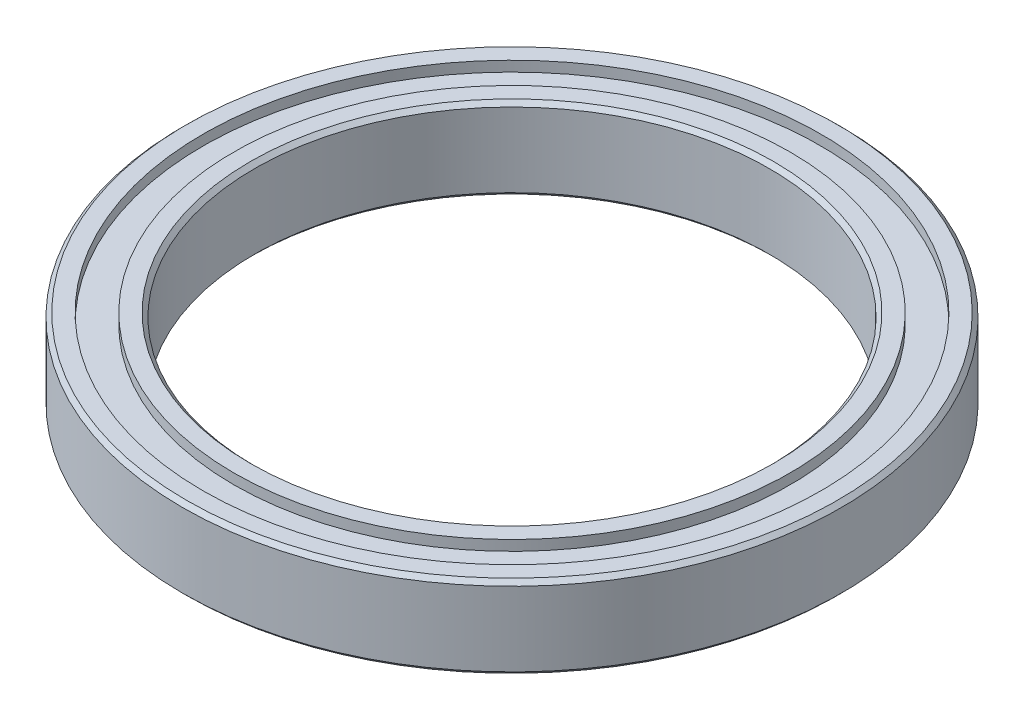
ISO-10303-21;
HEADER;
FILE_DESCRIPTION(('STEP AP214'),'2;1');
FILE_NAME('part.step','',(''),(''),'','','');
FILE_SCHEMA(('AUTOMOTIVE_DESIGN { 1 0 10303 214 1 1 1 1 }'));
ENDSEC;
DATA;
#1=APPLICATION_CONTEXT('core data for automotive mechanical design processes');
#2=APPLICATION_PROTOCOL_DEFINITION('international standard','automotive_design',2000,#1);
#3=PRODUCT_CONTEXT('',#1,'mechanical');
#4=PRODUCT('Part','Part','',(#3));
#5=PRODUCT_RELATED_PRODUCT_CATEGORY('part','',(#4));
#6=PRODUCT_DEFINITION_FORMATION('','',#4);
#7=PRODUCT_DEFINITION_CONTEXT('part definition',#1,'design');
#8=PRODUCT_DEFINITION('design','',#6,#7);
#9=PRODUCT_DEFINITION_SHAPE('','',#8);
#10=(LENGTH_UNIT() NAMED_UNIT(*) SI_UNIT(.MILLI.,.METRE.));
#11=(NAMED_UNIT(*) PLANE_ANGLE_UNIT() SI_UNIT($,.RADIAN.));
#12=(NAMED_UNIT(*) SI_UNIT($,.STERADIAN.) SOLID_ANGLE_UNIT());
#13=UNCERTAINTY_MEASURE_WITH_UNIT(LENGTH_MEASURE(1.E-05),#10,'distance_accuracy_value','');
#14=(GEOMETRIC_REPRESENTATION_CONTEXT(3) GLOBAL_UNCERTAINTY_ASSIGNED_CONTEXT((#13)) GLOBAL_UNIT_ASSIGNED_CONTEXT((#10,
#11,#12)) REPRESENTATION_CONTEXT('',''));
#15=CARTESIAN_POINT('',(0.,0.,0.));
#16=DIRECTION('',(0.,0.,1.));
#17=DIRECTION('',(1.,0.,0.));
#18=AXIS2_PLACEMENT_3D('',#15,#16,#17);
#19=CARTESIAN_POINT('',(0.,0.,0.));
#20=DIRECTION('',(0.,1.,0.));
#21=DIRECTION('',(0.,0.,1.));
#22=AXIS2_PLACEMENT_3D('',#19,#20,#21);
#23=PLANE('',#22);
#24=CARTESIAN_POINT('',(0.,0.,0.));
#25=DIRECTION('',(0.,1.,0.));
#26=DIRECTION('',(0.,0.,1.));
#27=AXIS2_PLACEMENT_3D('',#24,#25,#26);
#28=CIRCLE('',#27,12.7);
#29=CARTESIAN_POINT('',(0.,0.,12.7));
#30=VERTEX_POINT('',#29);
#31=EDGE_CURVE('E72',#30,#30,#28,.T.);
#32=ORIENTED_EDGE('',*,*,#31,.T.);
#33=EDGE_LOOP('',(#32));
#34=FACE_BOUND('',#33,.T.);
#35=CARTESIAN_POINT('',(0.,0.,0.));
#36=DIRECTION('',(0.,-1.,0.));
#37=DIRECTION('',(0.,0.,-1.));
#38=AXIS2_PLACEMENT_3D('',#35,#36,#37);
#39=CIRCLE('',#38,13.5);
#40=CARTESIAN_POINT('',(0.,0.,-13.5));
#41=VERTEX_POINT('',#40);
#42=EDGE_CURVE('E105',#41,#41,#39,.T.);
#43=ORIENTED_EDGE('',*,*,#42,.T.);
#44=EDGE_LOOP('',(#43));
#45=FACE_BOUND('',#44,.T.);
#46=ADVANCED_FACE('F39',(#34,#45),#23,.F.);
#47=CARTESIAN_POINT('',(0.,4.,0.));
#48=DIRECTION('',(0.,1.,0.));
#49=DIRECTION('',(0.,0.,1.));
#50=AXIS2_PLACEMENT_3D('',#47,#48,#49);
#51=PLANE('',#50);
#52=CARTESIAN_POINT('',(0.,4.,0.));
#53=DIRECTION('',(0.,1.,0.));
#54=DIRECTION('',(0.,0.,1.));
#55=AXIS2_PLACEMENT_3D('',#52,#53,#54);
#56=CIRCLE('',#55,12.7);
#57=CARTESIAN_POINT('',(0.,4.,12.7));
#58=VERTEX_POINT('',#57);
#59=EDGE_CURVE('E58',#58,#58,#56,.F.);
#60=ORIENTED_EDGE('',*,*,#59,.T.);
#61=EDGE_LOOP('',(#60));
#62=FACE_BOUND('',#61,.T.);
#63=CARTESIAN_POINT('',(0.,4.,0.));
#64=DIRECTION('',(0.,1.,0.));
#65=DIRECTION('',(0.,0.,1.));
#66=AXIS2_PLACEMENT_3D('',#63,#64,#65);
#67=CIRCLE('',#66,13.5);
#68=CARTESIAN_POINT('',(0.,4.,13.5));
#69=VERTEX_POINT('',#68);
#70=EDGE_CURVE('E89',#69,#69,#67,.T.);
#71=ORIENTED_EDGE('',*,*,#70,.T.);
#72=EDGE_LOOP('',(#71));
#73=FACE_BOUND('',#72,.T.);
#74=ADVANCED_FACE('F152',(#62,#73),#51,.T.);
#75=CARTESIAN_POINT('',(0.,4.,0.));
#76=DIRECTION('',(0.,1.,0.));
#77=DIRECTION('',(0.,0.,1.));
#78=AXIS2_PLACEMENT_3D('',#75,#76,#77);
#79=CIRCLE('',#78,15.);
#80=CARTESIAN_POINT('',(0.,4.,15.));
#81=VERTEX_POINT('',#80);
#82=EDGE_CURVE('E81',#81,#81,#79,.T.);
#83=ORIENTED_EDGE('',*,*,#82,.F.);
#84=EDGE_LOOP('',(#83));
#85=FACE_BOUND('',#84,.T.);
#86=CARTESIAN_POINT('',(0.,4.,0.));
#87=DIRECTION('',(0.,1.,0.));
#88=DIRECTION('',(0.,0.,1.));
#89=AXIS2_PLACEMENT_3D('',#86,#87,#88);
#90=CIRCLE('',#89,15.8);
#91=CARTESIAN_POINT('',(0.,4.,15.8));
#92=VERTEX_POINT('',#91);
#93=EDGE_CURVE('E53',#92,#92,#90,.T.);
#94=ORIENTED_EDGE('',*,*,#93,.T.);
#95=EDGE_LOOP('',(#94));
#96=FACE_BOUND('',#95,.T.);
#97=ADVANCED_FACE('F133',(#85,#96),#51,.T.);
#98=CARTESIAN_POINT('',(0.,0.,0.));
#99=DIRECTION('',(0.,-1.,0.));
#100=DIRECTION('',(0.,0.,-1.));
#101=AXIS2_PLACEMENT_3D('',#98,#99,#100);
#102=CIRCLE('',#101,15.);
#103=CARTESIAN_POINT('',(0.,0.,-15.));
#104=VERTEX_POINT('',#103);
#105=EDGE_CURVE('E97',#104,#104,#102,.T.);
#106=ORIENTED_EDGE('',*,*,#105,.F.);
#107=EDGE_LOOP('',(#106));
#108=FACE_BOUND('',#107,.T.);
#109=CARTESIAN_POINT('',(0.,0.,0.));
#110=DIRECTION('',(0.,1.,0.));
#111=DIRECTION('',(0.,0.,1.));
#112=AXIS2_PLACEMENT_3D('',#109,#110,#111);
#113=CIRCLE('',#112,15.8);
#114=CARTESIAN_POINT('',(0.,0.,15.8));
#115=VERTEX_POINT('',#114);
#116=EDGE_CURVE('E76',#115,#115,#113,.F.);
#117=ORIENTED_EDGE('',*,*,#116,.T.);
#118=EDGE_LOOP('',(#117));
#119=FACE_BOUND('',#118,.T.);
#120=ADVANCED_FACE('F129',(#108,#119),#23,.F.);
#121=CARTESIAN_POINT('',(0.,4.,0.));
#122=DIRECTION('',(0.,-1.,0.));
#123=DIRECTION('',(0.,0.,-1.));
#124=AXIS2_PLACEMENT_3D('',#121,#122,#123);
#125=CYLINDRICAL_SURFACE('',#124,16.);
#126=CARTESIAN_POINT('',(0.,3.8,0.));
#127=DIRECTION('',(0.,1.,0.));
#128=DIRECTION('',(0.,0.,1.));
#129=AXIS2_PLACEMENT_3D('',#126,#127,#128);
#130=CIRCLE('',#129,16.);
#131=CARTESIAN_POINT('',(0.,3.8,16.));
#132=VERTEX_POINT('',#131);
#133=EDGE_CURVE('E10',#132,#132,#130,.F.);
#134=ORIENTED_EDGE('',*,*,#133,.T.);
#135=EDGE_LOOP('',(#134));
#136=FACE_BOUND('',#135,.T.);
#137=CARTESIAN_POINT('',(0.,0.199999999999999,0.));
#138=DIRECTION('',(0.,1.,0.));
#139=DIRECTION('',(0.,0.,1.));
#140=AXIS2_PLACEMENT_3D('',#137,#138,#139);
#141=CIRCLE('',#140,16.);
#142=CARTESIAN_POINT('',(0.,0.199999999999999,16.));
#143=VERTEX_POINT('',#142);
#144=EDGE_CURVE('E48',#143,#143,#141,.T.);
#145=ORIENTED_EDGE('',*,*,#144,.T.);
#146=EDGE_LOOP('',(#145));
#147=FACE_BOUND('',#146,.T.);
#148=ADVANCED_FACE('F132',(#136,#147),#125,.T.);
#149=CARTESIAN_POINT('',(0.,4.,0.));
#150=DIRECTION('',(0.,-1.,0.));
#151=DIRECTION('',(0.,0.,-1.));
#152=AXIS2_PLACEMENT_3D('',#149,#150,#151);
#153=CYLINDRICAL_SURFACE('',#152,12.5);
#154=CARTESIAN_POINT('',(0.,0.19999999999999,0.));
#155=DIRECTION('',(0.,1.,0.));
#156=DIRECTION('',(0.,0.,1.));
#157=AXIS2_PLACEMENT_3D('',#154,#155,#156);
#158=CIRCLE('',#157,12.5);
#159=CARTESIAN_POINT('',(0.,0.19999999999999,12.5));
#160=VERTEX_POINT('',#159);
#161=EDGE_CURVE('E64',#160,#160,#158,.F.);
#162=ORIENTED_EDGE('',*,*,#161,.T.);
#163=EDGE_LOOP('',(#162));
#164=FACE_BOUND('',#163,.T.);
#165=CARTESIAN_POINT('',(0.,3.79999999999998,0.));
#166=DIRECTION('',(0.,1.,0.));
#167=DIRECTION('',(0.,0.,1.));
#168=AXIS2_PLACEMENT_3D('',#165,#166,#167);
#169=CIRCLE('',#168,12.5);
#170=CARTESIAN_POINT('',(0.,3.79999999999998,12.5));
#171=VERTEX_POINT('',#170);
#172=EDGE_CURVE('E68',#171,#171,#169,.T.);
#173=ORIENTED_EDGE('',*,*,#172,.T.);
#174=EDGE_LOOP('',(#173));
#175=FACE_BOUND('',#174,.T.);
#176=ADVANCED_FACE('F164',(#164,#175),#153,.F.);
#177=CARTESIAN_POINT('',(0.,0.,0.));
#178=DIRECTION('',(0.,-1.,0.));
#179=DIRECTION('',(0.,0.,-1.));
#180=AXIS2_PLACEMENT_3D('',#177,#178,#179);
#181=CONICAL_SURFACE('',#180,12.7,0.785398163397453);
#182=ORIENTED_EDGE('',*,*,#161,.F.);
#183=EDGE_LOOP('',(#182));
#184=FACE_BOUND('',#183,.T.);
#185=ORIENTED_EDGE('',*,*,#31,.F.);
#186=EDGE_LOOP('',(#185));
#187=FACE_BOUND('',#186,.T.);
#188=ADVANCED_FACE('F147',(#184,#187),#181,.F.);
#189=CARTESIAN_POINT('',(0.,4.,0.));
#190=DIRECTION('',(0.,-1.,0.));
#191=DIRECTION('',(0.,0.,-1.));
#192=AXIS2_PLACEMENT_3D('',#189,#190,#191);
#193=CONICAL_SURFACE('',#192,15.8,0.785398163397448);
#194=ORIENTED_EDGE('',*,*,#133,.F.);
#195=EDGE_LOOP('',(#194));
#196=FACE_BOUND('',#195,.T.);
#197=ORIENTED_EDGE('',*,*,#93,.F.);
#198=EDGE_LOOP('',(#197));
#199=FACE_BOUND('',#198,.T.);
#200=ADVANCED_FACE('F140',(#196,#199),#193,.T.);
#201=CARTESIAN_POINT('',(0.,0.199999999999999,0.));
#202=DIRECTION('',(0.,1.,0.));
#203=DIRECTION('',(0.,0.,1.));
#204=AXIS2_PLACEMENT_3D('',#201,#202,#203);
#205=CONICAL_SURFACE('',#204,16.,0.785398163397448);
#206=ORIENTED_EDGE('',*,*,#116,.F.);
#207=EDGE_LOOP('',(#206));
#208=FACE_BOUND('',#207,.T.);
#209=ORIENTED_EDGE('',*,*,#144,.F.);
#210=EDGE_LOOP('',(#209));
#211=FACE_BOUND('',#210,.T.);
#212=ADVANCED_FACE('F137',(#208,#211),#205,.T.);
#213=CARTESIAN_POINT('',(0.,3.79999999999998,0.));
#214=DIRECTION('',(0.,1.,0.));
#215=DIRECTION('',(0.,0.,1.));
#216=AXIS2_PLACEMENT_3D('',#213,#214,#215);
#217=CONICAL_SURFACE('',#216,12.5,0.78539816339744);
#218=CARTESIAN_POINT('',(0.,4.,12.7));
#219=CARTESIAN_POINT('',(0.,3.99791666666667,12.6979166666667));
#220=CARTESIAN_POINT('',(0.,3.99583333333333,12.6958333333334));
#221=CARTESIAN_POINT('',(0.,3.99166666666666,12.6916666666667));
#222=CARTESIAN_POINT('',(0.,3.98958333333333,12.6895833333333));
#223=CARTESIAN_POINT('',(0.,3.98541666666666,12.6854166666667));
#224=CARTESIAN_POINT('',(0.,3.98333333333333,12.6833333333333));
#225=CARTESIAN_POINT('',(0.,3.97916666666666,12.6791666666667));
#226=CARTESIAN_POINT('',(0.,3.97708333333333,12.6770833333333));
#227=CARTESIAN_POINT('',(0.,3.97291666666666,12.6729166666667));
#228=CARTESIAN_POINT('',(0.,3.97083333333333,12.6708333333333));
#229=CARTESIAN_POINT('',(0.,3.96666666666666,12.6666666666667));
#230=CARTESIAN_POINT('',(0.,3.96458333333333,12.6645833333333));
#231=CARTESIAN_POINT('',(0.,3.96041666666666,12.6604166666667));
#232=CARTESIAN_POINT('',(0.,3.95833333333333,12.6583333333333));
#233=CARTESIAN_POINT('',(0.,3.95416666666666,12.6541666666667));
#234=CARTESIAN_POINT('',(0.,3.95208333333333,12.6520833333333));
#235=CARTESIAN_POINT('',(0.,3.94791666666666,12.6479166666667));
#236=CARTESIAN_POINT('',(0.,3.94583333333333,12.6458333333333));
#237=CARTESIAN_POINT('',(0.,3.94166666666666,12.6416666666667));
#238=CARTESIAN_POINT('',(0.,3.93958333333333,12.6395833333333));
#239=CARTESIAN_POINT('',(0.,3.93541666666666,12.6354166666667));
#240=CARTESIAN_POINT('',(0.,3.93333333333333,12.6333333333333));
#241=CARTESIAN_POINT('',(0.,3.92916666666666,12.6291666666667));
#242=CARTESIAN_POINT('',(0.,3.92708333333333,12.6270833333333));
#243=CARTESIAN_POINT('',(0.,3.92291666666666,12.6229166666667));
#244=CARTESIAN_POINT('',(0.,3.92083333333332,12.6208333333333));
#245=CARTESIAN_POINT('',(0.,3.91666666666666,12.6166666666667));
#246=CARTESIAN_POINT('',(0.,3.91458333333332,12.6145833333333));
#247=CARTESIAN_POINT('',(0.,3.91041666666666,12.6104166666667));
#248=CARTESIAN_POINT('',(0.,3.90833333333332,12.6083333333333));
#249=CARTESIAN_POINT('',(0.,3.90416666666666,12.6041666666667));
#250=CARTESIAN_POINT('',(0.,3.90208333333332,12.6020833333333));
#251=CARTESIAN_POINT('',(0.,3.89791666666666,12.5979166666667));
#252=CARTESIAN_POINT('',(0.,3.89583333333332,12.5958333333333));
#253=CARTESIAN_POINT('',(0.,3.89166666666665,12.5916666666667));
#254=CARTESIAN_POINT('',(0.,3.88958333333332,12.5895833333333));
#255=CARTESIAN_POINT('',(0.,3.88541666666665,12.5854166666667));
#256=CARTESIAN_POINT('',(0.,3.88333333333332,12.5833333333333));
#257=CARTESIAN_POINT('',(0.,3.87916666666665,12.5791666666667));
#258=CARTESIAN_POINT('',(0.,3.87708333333332,12.5770833333333));
#259=CARTESIAN_POINT('',(0.,3.87291666666665,12.5729166666667));
#260=CARTESIAN_POINT('',(0.,3.87083333333332,12.5708333333333));
#261=CARTESIAN_POINT('',(0.,3.86666666666665,12.5666666666667));
#262=CARTESIAN_POINT('',(0.,3.86458333333332,12.5645833333333));
#263=CARTESIAN_POINT('',(0.,3.86041666666665,12.5604166666667));
#264=CARTESIAN_POINT('',(0.,3.85833333333332,12.5583333333333));
#265=CARTESIAN_POINT('',(0.,3.85416666666665,12.5541666666667));
#266=CARTESIAN_POINT('',(0.,3.85208333333332,12.5520833333333));
#267=CARTESIAN_POINT('',(0.,3.84791666666665,12.5479166666667));
#268=CARTESIAN_POINT('',(0.,3.84583333333332,12.5458333333333));
#269=CARTESIAN_POINT('',(0.,3.84166666666665,12.5416666666667));
#270=CARTESIAN_POINT('',(0.,3.83958333333332,12.5395833333333));
#271=CARTESIAN_POINT('',(0.,3.83541666666665,12.5354166666667));
#272=CARTESIAN_POINT('',(0.,3.83333333333332,12.5333333333333));
#273=CARTESIAN_POINT('',(0.,3.82916666666665,12.5291666666667));
#274=CARTESIAN_POINT('',(0.,3.82708333333331,12.5270833333333));
#275=CARTESIAN_POINT('',(0.,3.82291666666665,12.5229166666667));
#276=CARTESIAN_POINT('',(0.,3.82083333333331,12.5208333333333));
#277=CARTESIAN_POINT('',(0.,3.81666666666665,12.5166666666667));
#278=CARTESIAN_POINT('',(0.,3.81458333333331,12.5145833333333));
#279=CARTESIAN_POINT('',(0.,3.81041666666665,12.5104166666667));
#280=CARTESIAN_POINT('',(0.,3.80833333333331,12.5083333333333));
#281=CARTESIAN_POINT('',(0.,3.80416666666665,12.5041666666667));
#282=CARTESIAN_POINT('',(0.,3.80208333333331,12.5020833333333));
#283=CARTESIAN_POINT('',(0.,3.79999999999998,12.5));
#284=B_SPLINE_CURVE_WITH_KNOTS('',3,(#218,#219,#220,#221,#222,#223,#224,#225,#226,#227,#228,
#229,#230,#231,#232,#233,#234,#235,#236,#237,#238,#239,#240,#241,#242,#243,#244,#245,#246,#247,
#248,#249,#250,#251,#252,#253,#254,#255,#256,#257,#258,#259,#260,#261,#262,#263,#264,#265,#266,
#267,#268,#269,#270,#271,#272,#273,#274,#275,#276,#277,#278,#279,#280,#281,#282,#283),
.UNSPECIFIED.,.F.,.F.,(4,2,2,2,2,2,2,2,2,2,2,2,2,2,2,2,2,2,2,2,2,2,2,2,2,2,2,2,2,2,2,2,4),(0.,
0.00883883476483271,0.017677669529666,0.0265165042944975,0.0353553390593308,0.0441941738241635,
0.0530330085889969,0.0618718433538284,0.0707106781186617,0.079549512883495,0.0883883476483265,
0.0972271824131598,0.106066017177993,0.114904851942826,0.123743686707657,0.132582521472491,
0.141421356237324,0.150260191002155,0.159099025766988,0.167937860531821,0.176776695296655,
0.185615530061486,0.194454364826319,0.203293199591153,0.212132034355984,0.220970869120817,
0.229809703885651,0.238648538650484,0.247487373415315,0.256326208180148,0.265165042944981,
0.274003877709813,0.282842712474646),.UNSPECIFIED.);
#285=EDGE_CURVE('BSEAM42',#58,#171,#284,.T.);
#286=ORIENTED_EDGE('',*,*,#59,.F.);
#287=ORIENTED_EDGE('',*,*,#172,.F.);
#288=ORIENTED_EDGE('',*,*,#285,.T.);
#289=ORIENTED_EDGE('',*,*,#285,.F.);
#290=EDGE_LOOP('',(#286,#288,#287,#289));
#291=FACE_BOUND('',#290,.T.);
#292=ADVANCED_FACE('F42',(#291),#217,.F.);
#293=CARTESIAN_POINT('',(0.,3.5,0.));
#294=DIRECTION('',(0.,1.,0.));
#295=DIRECTION('',(0.,0.,1.));
#296=AXIS2_PLACEMENT_3D('',#293,#294,#295);
#297=CYLINDRICAL_SURFACE('',#296,15.);
#298=CARTESIAN_POINT('',(0.,3.5,0.));
#299=DIRECTION('',(0.,1.,0.));
#300=DIRECTION('',(0.,0.,1.));
#301=AXIS2_PLACEMENT_3D('',#298,#299,#300);
#302=CIRCLE('',#301,15.);
#303=CARTESIAN_POINT('',(0.,3.5,15.));
#304=VERTEX_POINT('',#303);
#305=EDGE_CURVE('E80',#304,#304,#302,.T.);
#306=ORIENTED_EDGE('',*,*,#305,.F.);
#307=EDGE_LOOP('',(#306));
#308=FACE_BOUND('',#307,.T.);
#309=ORIENTED_EDGE('',*,*,#82,.T.);
#310=EDGE_LOOP('',(#309));
#311=FACE_BOUND('',#310,.T.);
#312=ADVANCED_FACE('F145',(#308,#311),#297,.F.);
#313=CARTESIAN_POINT('',(0.,3.5,0.));
#314=DIRECTION('',(0.,1.,0.));
#315=DIRECTION('',(0.,0.,1.));
#316=AXIS2_PLACEMENT_3D('',#313,#314,#315);
#317=PLANE('',#316);
#318=CARTESIAN_POINT('',(0.,3.5,0.));
#319=DIRECTION('',(0.,1.,0.));
#320=DIRECTION('',(0.,0.,1.));
#321=AXIS2_PLACEMENT_3D('',#318,#319,#320);
#322=CIRCLE('',#321,13.5);
#323=CARTESIAN_POINT('',(0.,3.5,13.5));
#324=VERTEX_POINT('',#323);
#325=EDGE_CURVE('E85',#324,#324,#322,.T.);
#326=ORIENTED_EDGE('',*,*,#325,.F.);
#327=EDGE_LOOP('',(#326));
#328=FACE_BOUND('',#327,.T.);
#329=ORIENTED_EDGE('',*,*,#305,.T.);
#330=EDGE_LOOP('',(#329));
#331=FACE_BOUND('',#330,.T.);
#332=ADVANCED_FACE('F192',(#328,#331),#317,.T.);
#333=CARTESIAN_POINT('',(0.,3.5,0.));
#334=DIRECTION('',(0.,1.,0.));
#335=DIRECTION('',(0.,0.,1.));
#336=AXIS2_PLACEMENT_3D('',#333,#334,#335);
#337=CYLINDRICAL_SURFACE('',#336,13.5);
#338=ORIENTED_EDGE('',*,*,#325,.T.);
#339=EDGE_LOOP('',(#338));
#340=FACE_BOUND('',#339,.T.);
#341=ORIENTED_EDGE('',*,*,#70,.F.);
#342=EDGE_LOOP('',(#341));
#343=FACE_BOUND('',#342,.T.);
#344=ADVANCED_FACE('F125',(#340,#343),#337,.T.);
#345=CARTESIAN_POINT('',(0.,0.5,0.));
#346=DIRECTION('',(0.,-1.,0.));
#347=DIRECTION('',(0.,0.,-1.));
#348=AXIS2_PLACEMENT_3D('',#345,#346,#347);
#349=CYLINDRICAL_SURFACE('',#348,15.);
#350=CARTESIAN_POINT('',(0.,0.5,0.));
#351=DIRECTION('',(0.,-1.,0.));
#352=DIRECTION('',(0.,0.,-1.));
#353=AXIS2_PLACEMENT_3D('',#350,#351,#352);
#354=CIRCLE('',#353,15.);
#355=CARTESIAN_POINT('',(0.,0.5,-15.));
#356=VERTEX_POINT('',#355);
#357=EDGE_CURVE('E93',#356,#356,#354,.T.);
#358=ORIENTED_EDGE('',*,*,#357,.F.);
#359=EDGE_LOOP('',(#358));
#360=FACE_BOUND('',#359,.T.);
#361=ORIENTED_EDGE('',*,*,#105,.T.);
#362=EDGE_LOOP('',(#361));
#363=FACE_BOUND('',#362,.T.);
#364=ADVANCED_FACE('F119',(#360,#363),#349,.F.);
#365=CARTESIAN_POINT('',(0.,0.5,0.));
#366=DIRECTION('',(0.,-1.,0.));
#367=DIRECTION('',(0.,0.,-1.));
#368=AXIS2_PLACEMENT_3D('',#365,#366,#367);
#369=PLANE('',#368);
#370=CARTESIAN_POINT('',(0.,0.5,0.));
#371=DIRECTION('',(0.,-1.,0.));
#372=DIRECTION('',(0.,0.,-1.));
#373=AXIS2_PLACEMENT_3D('',#370,#371,#372);
#374=CIRCLE('',#373,13.5);
#375=CARTESIAN_POINT('',(0.,0.5,-13.5));
#376=VERTEX_POINT('',#375);
#377=EDGE_CURVE('E101',#376,#376,#374,.T.);
#378=ORIENTED_EDGE('',*,*,#377,.F.);
#379=EDGE_LOOP('',(#378));
#380=FACE_BOUND('',#379,.T.);
#381=ORIENTED_EDGE('',*,*,#357,.T.);
#382=EDGE_LOOP('',(#381));
#383=FACE_BOUND('',#382,.T.);
#384=ADVANCED_FACE('F116',(#380,#383),#369,.T.);
#385=CARTESIAN_POINT('',(0.,0.5,0.));
#386=DIRECTION('',(0.,-1.,0.));
#387=DIRECTION('',(0.,0.,-1.));
#388=AXIS2_PLACEMENT_3D('',#385,#386,#387);
#389=CYLINDRICAL_SURFACE('',#388,13.5);
#390=ORIENTED_EDGE('',*,*,#377,.T.);
#391=EDGE_LOOP('',(#390));
#392=FACE_BOUND('',#391,.T.);
#393=ORIENTED_EDGE('',*,*,#42,.F.);
#394=EDGE_LOOP('',(#393));
#395=FACE_BOUND('',#394,.T.);
#396=ADVANCED_FACE('F113',(#392,#395),#389,.T.);
#397=CLOSED_SHELL('',(#46,#74,#97,#120,#148,#176,#188,#200,#212,#292,#312,#332,#344,#364,#384,#396));
#398=MANIFOLD_SOLID_BREP('B2',#397);
#399=ADVANCED_BREP_SHAPE_REPRESENTATION('',(#18,#398),#14);
#400=SHAPE_DEFINITION_REPRESENTATION(#9,#399);
ENDSEC;
END-ISO-10303-21;
